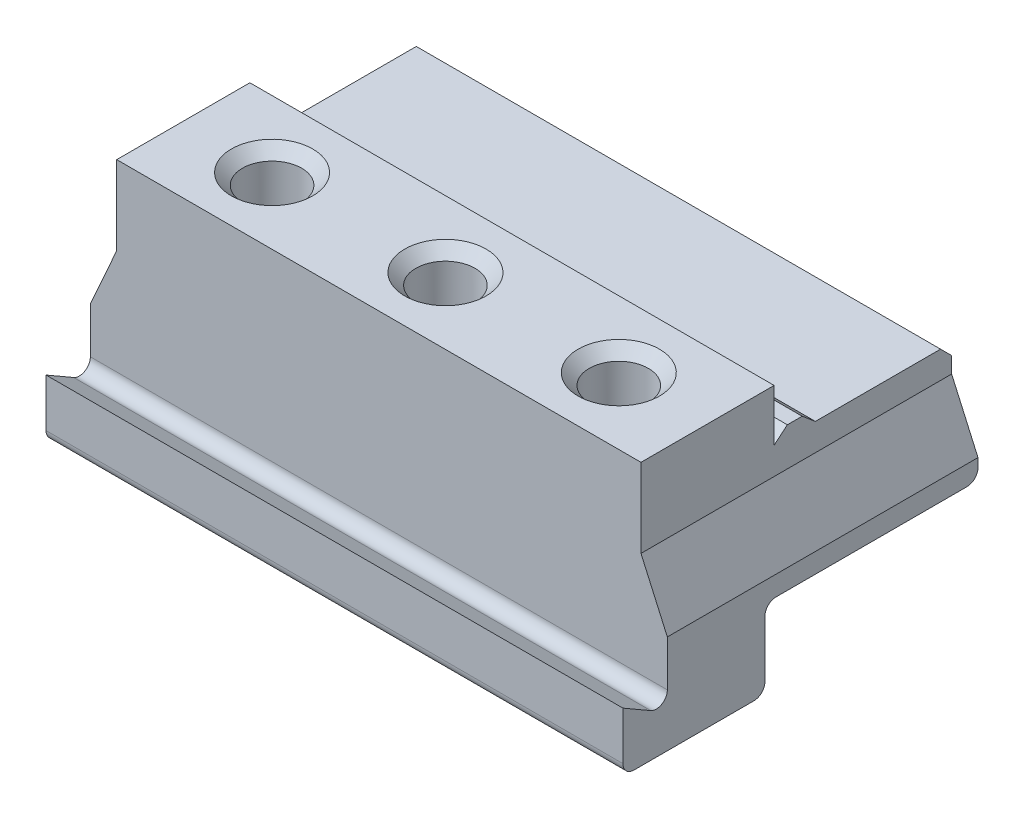
ISO-10303-21;
HEADER;
FILE_DESCRIPTION(('STEP AP214'),'2;1');
FILE_NAME('part.step','',(''),(''),'','','');
FILE_SCHEMA(('AUTOMOTIVE_DESIGN { 1 0 10303 214 1 1 1 1 }'));
ENDSEC;
DATA;
#1=APPLICATION_CONTEXT('core data for automotive mechanical design processes');
#2=APPLICATION_PROTOCOL_DEFINITION('international standard','automotive_design',2000,#1);
#3=PRODUCT_CONTEXT('',#1,'mechanical');
#4=PRODUCT('Part','Part','',(#3));
#5=PRODUCT_RELATED_PRODUCT_CATEGORY('part','',(#4));
#6=PRODUCT_DEFINITION_FORMATION('','',#4);
#7=PRODUCT_DEFINITION_CONTEXT('part definition',#1,'design');
#8=PRODUCT_DEFINITION('design','',#6,#7);
#9=PRODUCT_DEFINITION_SHAPE('','',#8);
#10=(LENGTH_UNIT() NAMED_UNIT(*) SI_UNIT(.MILLI.,.METRE.));
#11=(NAMED_UNIT(*) PLANE_ANGLE_UNIT() SI_UNIT($,.RADIAN.));
#12=(NAMED_UNIT(*) SI_UNIT($,.STERADIAN.) SOLID_ANGLE_UNIT());
#13=UNCERTAINTY_MEASURE_WITH_UNIT(LENGTH_MEASURE(1.E-05),#10,'distance_accuracy_value','');
#14=(GEOMETRIC_REPRESENTATION_CONTEXT(3) GLOBAL_UNCERTAINTY_ASSIGNED_CONTEXT((#13)) GLOBAL_UNIT_ASSIGNED_CONTEXT((#10,
#11,#12)) REPRESENTATION_CONTEXT('',''));
#15=CARTESIAN_POINT('',(0.,0.,0.));
#16=DIRECTION('',(0.,0.,1.));
#17=DIRECTION('',(1.,0.,0.));
#18=AXIS2_PLACEMENT_3D('',#15,#16,#17);
#19=CARTESIAN_POINT('',(78.,1.5,0.));
#20=DIRECTION('',(0.,0.,-1.));
#21=DIRECTION('',(0.,1.,0.));
#22=AXIS2_PLACEMENT_3D('',#19,#20,#21);
#23=PLANE('',#22);
#24=DIRECTION('',(0.,-1.,0.));
#25=VECTOR('',#24,1.);
#26=CARTESIAN_POINT('',(0.,1.5,0.));
#27=LINE('',#26,#25);
#28=CARTESIAN_POINT('',(0.,8.,0.));
#29=VERTEX_POINT('',#28);
#30=CARTESIAN_POINT('',(0.,1.5,0.));
#31=VERTEX_POINT('',#30);
#32=EDGE_CURVE('E279',#29,#31,#27,.T.);
#33=ORIENTED_EDGE('',*,*,#32,.T.);
#34=DIRECTION('',(-1.,0.,0.));
#35=VECTOR('',#34,1.);
#36=CARTESIAN_POINT('',(78.,1.5,0.));
#37=LINE('',#36,#35);
#38=CARTESIAN_POINT('',(78.,1.5,0.));
#39=VERTEX_POINT('',#38);
#40=EDGE_CURVE('E381',#39,#31,#37,.T.);
#41=ORIENTED_EDGE('',*,*,#40,.F.);
#42=DIRECTION('',(0.,-1.,0.));
#43=VECTOR('',#42,1.);
#44=CARTESIAN_POINT('',(78.,1.5,0.));
#45=LINE('',#44,#43);
#46=CARTESIAN_POINT('',(78.,8.,0.));
#47=VERTEX_POINT('',#46);
#48=EDGE_CURVE('E280',#47,#39,#45,.T.);
#49=ORIENTED_EDGE('',*,*,#48,.F.);
#50=DIRECTION('',(-1.,0.,0.));
#51=VECTOR('',#50,1.);
#52=CARTESIAN_POINT('',(78.,8.,0.));
#53=LINE('',#52,#51);
#54=EDGE_CURVE('E307',#47,#29,#53,.T.);
#55=ORIENTED_EDGE('',*,*,#54,.T.);
#56=EDGE_LOOP('',(#33,#41,#49,#55));
#57=FACE_BOUND('',#56,.T.);
#58=ADVANCED_FACE('F36',(#57),#23,.F.);
#59=CARTESIAN_POINT('',(78.,1.5,-1.5));
#60=DIRECTION('',(-1.,0.,0.));
#61=DIRECTION('',(0.,0.,1.));
#62=AXIS2_PLACEMENT_3D('',#59,#60,#61);
#63=CYLINDRICAL_SURFACE('',#62,1.5);
#64=CARTESIAN_POINT('',(0.,1.5,-1.5));
#65=DIRECTION('',(1.,0.,0.));
#66=DIRECTION('',(0.,0.,1.));
#67=AXIS2_PLACEMENT_3D('',#64,#65,#66);
#68=CIRCLE('',#67,1.5);
#69=CARTESIAN_POINT('',(0.,0.,-1.5));
#70=VERTEX_POINT('',#69);
#71=EDGE_CURVE('E310',#31,#70,#68,.T.);
#72=ORIENTED_EDGE('',*,*,#71,.T.);
#73=DIRECTION('',(-1.,0.,0.));
#74=VECTOR('',#73,1.);
#75=CARTESIAN_POINT('',(78.,0.,-1.5));
#76=LINE('',#75,#74);
#77=CARTESIAN_POINT('',(78.,0.,-1.5));
#78=VERTEX_POINT('',#77);
#79=EDGE_CURVE('E378',#78,#70,#76,.T.);
#80=ORIENTED_EDGE('',*,*,#79,.F.);
#81=CARTESIAN_POINT('',(78.,1.5,-1.5));
#82=DIRECTION('',(1.,0.,0.));
#83=DIRECTION('',(0.,0.,1.));
#84=AXIS2_PLACEMENT_3D('',#81,#82,#83);
#85=CIRCLE('',#84,1.5);
#86=EDGE_CURVE('E283',#39,#78,#85,.T.);
#87=ORIENTED_EDGE('',*,*,#86,.F.);
#88=ORIENTED_EDGE('',*,*,#40,.T.);
#89=EDGE_LOOP('',(#72,#80,#87,#88));
#90=FACE_BOUND('',#89,.T.);
#91=ADVANCED_FACE('F466',(#90),#63,.T.);
#92=CARTESIAN_POINT('',(78.,0.,-17.7));
#93=DIRECTION('',(0.,1.,0.));
#94=DIRECTION('',(0.,0.,1.));
#95=AXIS2_PLACEMENT_3D('',#92,#93,#94);
#96=PLANE('',#95);
#97=DIRECTION('',(0.,0.,-1.));
#98=VECTOR('',#97,1.);
#99=CARTESIAN_POINT('',(0.,0.,-17.7));
#100=LINE('',#99,#98);
#101=CARTESIAN_POINT('',(0.,0.,-17.7));
#102=VERTEX_POINT('',#101);
#103=EDGE_CURVE('E312',#70,#102,#100,.T.);
#104=ORIENTED_EDGE('',*,*,#103,.T.);
#105=DIRECTION('',(-1.,0.,0.));
#106=VECTOR('',#105,1.);
#107=CARTESIAN_POINT('',(78.,0.,-17.7));
#108=LINE('',#107,#106);
#109=CARTESIAN_POINT('',(78.,0.,-17.7));
#110=VERTEX_POINT('',#109);
#111=EDGE_CURVE('E375',#110,#102,#108,.T.);
#112=ORIENTED_EDGE('',*,*,#111,.F.);
#113=DIRECTION('',(0.,0.,-1.));
#114=VECTOR('',#113,1.);
#115=CARTESIAN_POINT('',(78.,0.,-17.7));
#116=LINE('',#115,#114);
#117=EDGE_CURVE('E286',#78,#110,#116,.T.);
#118=ORIENTED_EDGE('',*,*,#117,.F.);
#119=ORIENTED_EDGE('',*,*,#79,.T.);
#120=EDGE_LOOP('',(#104,#112,#118,#119));
#121=FACE_BOUND('',#120,.T.);
#122=ADVANCED_FACE('F473',(#121),#96,.F.);
#123=CARTESIAN_POINT('',(78.,1.5,-17.7));
#124=DIRECTION('',(-1.,0.,0.));
#125=DIRECTION('',(0.,0.,1.));
#126=AXIS2_PLACEMENT_3D('',#123,#124,#125);
#127=CYLINDRICAL_SURFACE('',#126,1.5);
#128=CARTESIAN_POINT('',(0.,1.5,-17.7));
#129=DIRECTION('',(1.,0.,0.));
#130=DIRECTION('',(0.,0.,1.));
#131=AXIS2_PLACEMENT_3D('',#128,#129,#130);
#132=CIRCLE('',#131,1.5);
#133=CARTESIAN_POINT('',(0.,1.5,-19.2));
#134=VERTEX_POINT('',#133);
#135=EDGE_CURVE('E314',#102,#134,#132,.T.);
#136=ORIENTED_EDGE('',*,*,#135,.T.);
#137=DIRECTION('',(-1.,0.,0.));
#138=VECTOR('',#137,1.);
#139=CARTESIAN_POINT('',(78.,1.5,-19.2));
#140=LINE('',#139,#138);
#141=CARTESIAN_POINT('',(78.,1.5,-19.2));
#142=VERTEX_POINT('',#141);
#143=EDGE_CURVE('E372',#142,#134,#140,.T.);
#144=ORIENTED_EDGE('',*,*,#143,.F.);
#145=CARTESIAN_POINT('',(78.,1.5,-17.7));
#146=DIRECTION('',(1.,0.,0.));
#147=DIRECTION('',(0.,0.,1.));
#148=AXIS2_PLACEMENT_3D('',#145,#146,#147);
#149=CIRCLE('',#148,1.5);
#150=EDGE_CURVE('E288',#110,#142,#149,.T.);
#151=ORIENTED_EDGE('',*,*,#150,.F.);
#152=ORIENTED_EDGE('',*,*,#111,.T.);
#153=EDGE_LOOP('',(#136,#144,#151,#152));
#154=FACE_BOUND('',#153,.T.);
#155=ADVANCED_FACE('F477',(#154),#127,.T.);
#156=CARTESIAN_POINT('',(78.,9.16666666666666,-19.2));
#157=DIRECTION('',(0.,0.,1.));
#158=DIRECTION('',(0.,-1.,0.));
#159=AXIS2_PLACEMENT_3D('',#156,#157,#158);
#160=PLANE('',#159);
#161=DIRECTION('',(0.,1.,0.));
#162=VECTOR('',#161,1.);
#163=CARTESIAN_POINT('',(0.,9.16666666666666,-19.2));
#164=LINE('',#163,#162);
#165=CARTESIAN_POINT('',(0.,9.16666666666666,-19.2));
#166=VERTEX_POINT('',#165);
#167=EDGE_CURVE('E316',#134,#166,#164,.T.);
#168=ORIENTED_EDGE('',*,*,#167,.T.);
#169=DIRECTION('',(-1.,0.,0.));
#170=VECTOR('',#169,1.);
#171=CARTESIAN_POINT('',(78.,9.16666666666666,-19.2));
#172=LINE('',#171,#170);
#173=CARTESIAN_POINT('',(78.,9.16666666666666,-19.2));
#174=VERTEX_POINT('',#173);
#175=EDGE_CURVE('E369',#174,#166,#172,.T.);
#176=ORIENTED_EDGE('',*,*,#175,.F.);
#177=DIRECTION('',(0.,1.,0.));
#178=VECTOR('',#177,1.);
#179=CARTESIAN_POINT('',(78.,9.16666666666666,-19.2));
#180=LINE('',#179,#178);
#181=EDGE_CURVE('E290',#142,#174,#180,.T.);
#182=ORIENTED_EDGE('',*,*,#181,.F.);
#183=ORIENTED_EDGE('',*,*,#143,.T.);
#184=EDGE_LOOP('',(#168,#176,#182,#183));
#185=FACE_BOUND('',#184,.T.);
#186=ADVANCED_FACE('F482',(#185),#160,.F.);
#187=CARTESIAN_POINT('',(78.,9.16666666666666,-20.7));
#188=DIRECTION('',(-1.,0.,0.));
#189=DIRECTION('',(0.,0.,1.));
#190=AXIS2_PLACEMENT_3D('',#187,#188,#189);
#191=CYLINDRICAL_SURFACE('',#190,1.5);
#192=CARTESIAN_POINT('',(0.,9.16666666666666,-20.7));
#193=DIRECTION('',(-1.,0.,0.));
#194=DIRECTION('',(0.,0.,-1.));
#195=AXIS2_PLACEMENT_3D('',#192,#193,#194);
#196=CIRCLE('',#195,1.5);
#197=CARTESIAN_POINT('',(0.,10.6666666666667,-20.7));
#198=VERTEX_POINT('',#197);
#199=EDGE_CURVE('E318',#166,#198,#196,.T.);
#200=ORIENTED_EDGE('',*,*,#199,.T.);
#201=DIRECTION('',(-1.,0.,0.));
#202=VECTOR('',#201,1.);
#203=CARTESIAN_POINT('',(78.,10.6666666666667,-20.7));
#204=LINE('',#203,#202);
#205=CARTESIAN_POINT('',(78.,10.6666666666667,-20.7));
#206=VERTEX_POINT('',#205);
#207=EDGE_CURVE('E366',#206,#198,#204,.T.);
#208=ORIENTED_EDGE('',*,*,#207,.F.);
#209=CARTESIAN_POINT('',(78.,9.16666666666666,-20.7));
#210=DIRECTION('',(-1.,0.,0.));
#211=DIRECTION('',(0.,0.,-1.));
#212=AXIS2_PLACEMENT_3D('',#209,#210,#211);
#213=CIRCLE('',#212,1.5);
#214=EDGE_CURVE('E292',#174,#206,#213,.T.);
#215=ORIENTED_EDGE('',*,*,#214,.F.);
#216=ORIENTED_EDGE('',*,*,#175,.T.);
#217=EDGE_LOOP('',(#200,#208,#215,#216));
#218=FACE_BOUND('',#217,.T.);
#219=ADVANCED_FACE('F488',(#218),#191,.F.);
#220=CARTESIAN_POINT('',(78.,10.6666666666667,-46.5));
#221=DIRECTION('',(0.,1.,0.));
#222=DIRECTION('',(0.,0.,1.));
#223=AXIS2_PLACEMENT_3D('',#220,#221,#222);
#224=PLANE('',#223);
#225=DIRECTION('',(0.,0.,-1.));
#226=VECTOR('',#225,1.);
#227=CARTESIAN_POINT('',(0.,10.6666666666667,-46.5));
#228=LINE('',#227,#226);
#229=CARTESIAN_POINT('',(0.,10.6666666666667,-46.5));
#230=VERTEX_POINT('',#229);
#231=EDGE_CURVE('E320',#198,#230,#228,.T.);
#232=ORIENTED_EDGE('',*,*,#231,.T.);
#233=DIRECTION('',(-1.,0.,0.));
#234=VECTOR('',#233,1.);
#235=CARTESIAN_POINT('',(78.,10.6666666666667,-46.5));
#236=LINE('',#235,#234);
#237=CARTESIAN_POINT('',(78.,10.6666666666667,-46.5));
#238=VERTEX_POINT('',#237);
#239=EDGE_CURVE('E363',#238,#230,#236,.T.);
#240=ORIENTED_EDGE('',*,*,#239,.F.);
#241=DIRECTION('',(0.,0.,-1.));
#242=VECTOR('',#241,1.);
#243=CARTESIAN_POINT('',(78.,10.6666666666667,-46.5));
#244=LINE('',#243,#242);
#245=EDGE_CURVE('E294',#206,#238,#244,.T.);
#246=ORIENTED_EDGE('',*,*,#245,.F.);
#247=ORIENTED_EDGE('',*,*,#207,.T.);
#248=EDGE_LOOP('',(#232,#240,#246,#247));
#249=FACE_BOUND('',#248,.T.);
#250=ADVANCED_FACE('F492',(#249),#224,.F.);
#251=CARTESIAN_POINT('',(78.,12.1666666666667,-46.5));
#252=DIRECTION('',(-1.,0.,0.));
#253=DIRECTION('',(0.,0.,1.));
#254=AXIS2_PLACEMENT_3D('',#251,#252,#253);
#255=CYLINDRICAL_SURFACE('',#254,1.5);
#256=CARTESIAN_POINT('',(0.,12.1666666666667,-46.5));
#257=DIRECTION('',(1.,0.,0.));
#258=DIRECTION('',(0.,0.,1.));
#259=AXIS2_PLACEMENT_3D('',#256,#257,#258);
#260=CIRCLE('',#259,1.5);
#261=CARTESIAN_POINT('',(0.,12.1666666666667,-48.));
#262=VERTEX_POINT('',#261);
#263=EDGE_CURVE('E322',#230,#262,#260,.T.);
#264=ORIENTED_EDGE('',*,*,#263,.T.);
#265=DIRECTION('',(-1.,0.,0.));
#266=VECTOR('',#265,1.);
#267=CARTESIAN_POINT('',(78.,12.1666666666667,-48.));
#268=LINE('',#267,#266);
#269=CARTESIAN_POINT('',(78.,12.1666666666667,-48.));
#270=VERTEX_POINT('',#269);
#271=EDGE_CURVE('E361',#270,#262,#268,.T.);
#272=ORIENTED_EDGE('',*,*,#271,.F.);
#273=CARTESIAN_POINT('',(78.,12.1666666666667,-46.5));
#274=DIRECTION('',(1.,0.,0.));
#275=DIRECTION('',(0.,0.,1.));
#276=AXIS2_PLACEMENT_3D('',#273,#274,#275);
#277=CIRCLE('',#276,1.5);
#278=EDGE_CURVE('E296',#238,#270,#277,.T.);
#279=ORIENTED_EDGE('',*,*,#278,.F.);
#280=ORIENTED_EDGE('',*,*,#239,.T.);
#281=EDGE_LOOP('',(#264,#272,#279,#280));
#282=FACE_BOUND('',#281,.T.);
#283=ADVANCED_FACE('F497',(#282),#255,.T.);
#284=CARTESIAN_POINT('',(78.,23.5,-48.));
#285=DIRECTION('',(0.,0.,1.));
#286=DIRECTION('',(0.,-1.,0.));
#287=AXIS2_PLACEMENT_3D('',#284,#285,#286);
#288=PLANE('',#287);
#289=DIRECTION('',(0.406736643075801,0.913545457642601,0.));
#290=VECTOR('',#289,1.);
#291=CARTESIAN_POINT('',(0.,13.3333333333333,-48.));
#292=LINE('',#291,#290);
#293=CARTESIAN_POINT('',(0.,13.3333333333333,-48.));
#294=VERTEX_POINT('',#293);
#295=CARTESIAN_POINT('',(3.5618294824683,21.3333333333333,-48.));
#296=VERTEX_POINT('',#295);
#297=EDGE_CURVE('E59',#294,#296,#292,.T.);
#298=ORIENTED_EDGE('',*,*,#297,.T.);
#299=DIRECTION('',(0.,1.,0.));
#300=VECTOR('',#299,1.);
#301=CARTESIAN_POINT('',(3.5618294824683,32.,-48.));
#302=LINE('',#301,#300);
#303=CARTESIAN_POINT('',(3.5618294824683,23.5,-48.));
#304=VERTEX_POINT('',#303);
#305=EDGE_CURVE('E201',#296,#304,#302,.T.);
#306=ORIENTED_EDGE('',*,*,#305,.T.);
#307=DIRECTION('',(-1.,0.,0.));
#308=VECTOR('',#307,1.);
#309=CARTESIAN_POINT('',(78.,23.5,-48.));
#310=LINE('',#309,#308);
#311=CARTESIAN_POINT('',(74.4381705175317,23.5,-48.));
#312=VERTEX_POINT('',#311);
#313=EDGE_CURVE('E359',#312,#304,#310,.T.);
#314=ORIENTED_EDGE('',*,*,#313,.F.);
#315=DIRECTION('',(0.,-1.,0.));
#316=VECTOR('',#315,1.);
#317=CARTESIAN_POINT('',(74.4381705175317,32.,-48.));
#318=LINE('',#317,#316);
#319=CARTESIAN_POINT('',(74.4381705175317,21.3333333333333,-48.));
#320=VERTEX_POINT('',#319);
#321=EDGE_CURVE('E229',#312,#320,#318,.T.);
#322=ORIENTED_EDGE('',*,*,#321,.T.);
#323=DIRECTION('',(0.406736643075803,-0.9135454576426,0.));
#324=VECTOR('',#323,1.);
#325=CARTESIAN_POINT('',(78.,13.3333333333333,-48.));
#326=LINE('',#325,#324);
#327=CARTESIAN_POINT('',(78.,13.3333333333333,-48.));
#328=VERTEX_POINT('',#327);
#329=EDGE_CURVE('E232',#320,#328,#326,.T.);
#330=ORIENTED_EDGE('',*,*,#329,.T.);
#331=DIRECTION('',(0.,1.,0.));
#332=VECTOR('',#331,1.);
#333=CARTESIAN_POINT('',(78.,23.5,-48.));
#334=LINE('',#333,#332);
#335=EDGE_CURVE('E298',#270,#328,#334,.T.);
#336=ORIENTED_EDGE('',*,*,#335,.F.);
#337=ORIENTED_EDGE('',*,*,#271,.T.);
#338=DIRECTION('',(0.,1.,0.));
#339=VECTOR('',#338,1.);
#340=CARTESIAN_POINT('',(0.,23.5,-48.));
#341=LINE('',#340,#339);
#342=EDGE_CURVE('E213',#262,#294,#341,.T.);
#343=ORIENTED_EDGE('',*,*,#342,.T.);
#344=EDGE_LOOP('',(#298,#306,#314,#322,#330,#336,#337,#343));
#345=FACE_BOUND('',#344,.T.);
#346=ADVANCED_FACE('F210',(#345),#288,.F.);
#347=CARTESIAN_POINT('',(78.,25.,-46.5));
#348=DIRECTION('',(0.,-0.707106781186549,0.707106781186546));
#349=DIRECTION('',(0.,-0.707106781186546,-0.707106781186549));
#350=AXIS2_PLACEMENT_3D('',#347,#348,#349);
#351=PLANE('',#350);
#352=ORIENTED_EDGE('',*,*,#313,.T.);
#353=DIRECTION('',(0.,0.707106781186546,0.707106781186549));
#354=VECTOR('',#353,1.);
#355=CARTESIAN_POINT('',(3.56182948246829,25.,-46.5));
#356=LINE('',#355,#354);
#357=CARTESIAN_POINT('',(3.56182948246829,25.,-46.5));
#358=VERTEX_POINT('',#357);
#359=EDGE_CURVE('E204',#304,#358,#356,.T.);
#360=ORIENTED_EDGE('',*,*,#359,.T.);
#361=DIRECTION('',(-1.,0.,0.));
#362=VECTOR('',#361,1.);
#363=CARTESIAN_POINT('',(78.,25.,-46.5));
#364=LINE('',#363,#362);
#365=CARTESIAN_POINT('',(74.4381705175317,25.,-46.5));
#366=VERTEX_POINT('',#365);
#367=EDGE_CURVE('E356',#366,#358,#364,.T.);
#368=ORIENTED_EDGE('',*,*,#367,.F.);
#369=DIRECTION('',(0.,-0.707106781186546,-0.707106781186549));
#370=VECTOR('',#369,1.);
#371=CARTESIAN_POINT('',(74.4381705175317,25.,-46.5));
#372=LINE('',#371,#370);
#373=EDGE_CURVE('E260',#366,#312,#372,.T.);
#374=ORIENTED_EDGE('',*,*,#373,.T.);
#375=EDGE_LOOP('',(#352,#360,#368,#374));
#376=FACE_BOUND('',#375,.T.);
#377=ADVANCED_FACE('F439',(#376),#351,.F.);
#378=CARTESIAN_POINT('',(78.,25.,-29.5752607777826));
#379=DIRECTION('',(0.,-1.,0.));
#380=DIRECTION('',(0.,0.,-1.));
#381=AXIS2_PLACEMENT_3D('',#378,#379,#380);
#382=PLANE('',#381);
#383=ORIENTED_EDGE('',*,*,#367,.T.);
#384=DIRECTION('',(0.,0.,1.));
#385=VECTOR('',#384,1.);
#386=CARTESIAN_POINT('',(3.56182948246829,25.,-29.5752607777826));
#387=LINE('',#386,#385);
#388=CARTESIAN_POINT('',(3.56182948246829,25.,-29.5752607777826));
#389=VERTEX_POINT('',#388);
#390=EDGE_CURVE('E275',#358,#389,#387,.T.);
#391=ORIENTED_EDGE('',*,*,#390,.T.);
#392=DIRECTION('',(-1.,0.,0.));
#393=VECTOR('',#392,1.);
#394=CARTESIAN_POINT('',(78.,25.,-29.5752607777826));
#395=LINE('',#394,#393);
#396=CARTESIAN_POINT('',(74.4381705175317,25.,-29.5752607777826));
#397=VERTEX_POINT('',#396);
#398=EDGE_CURVE('E353',#397,#389,#395,.T.);
#399=ORIENTED_EDGE('',*,*,#398,.F.);
#400=DIRECTION('',(0.,0.,-1.));
#401=VECTOR('',#400,1.);
#402=CARTESIAN_POINT('',(74.4381705175317,25.,-29.5752607777826));
#403=LINE('',#402,#401);
#404=EDGE_CURVE('E257',#397,#366,#403,.T.);
#405=ORIENTED_EDGE('',*,*,#404,.T.);
#406=EDGE_LOOP('',(#383,#391,#399,#405));
#407=FACE_BOUND('',#406,.T.);
#408=ADVANCED_FACE('F436',(#407),#382,.F.);
#409=CARTESIAN_POINT('',(78.,26.5,-27.7876303888913));
#410=DIRECTION('',(0.,-0.766044443118974,0.642787609686544));
#411=DIRECTION('',(0.,-0.642787609686544,-0.766044443118974));
#412=AXIS2_PLACEMENT_3D('',#409,#410,#411);
#413=PLANE('',#412);
#414=ORIENTED_EDGE('',*,*,#398,.T.);
#415=DIRECTION('',(0.,0.642787609686544,0.766044443118975));
#416=VECTOR('',#415,1.);
#417=CARTESIAN_POINT('',(3.56182948246829,26.5,-27.7876303888913));
#418=LINE('',#417,#416);
#419=CARTESIAN_POINT('',(3.56182948246829,26.5,-27.7876303888913));
#420=VERTEX_POINT('',#419);
#421=EDGE_CURVE('E272',#389,#420,#418,.T.);
#422=ORIENTED_EDGE('',*,*,#421,.T.);
#423=DIRECTION('',(-1.,0.,0.));
#424=VECTOR('',#423,1.);
#425=CARTESIAN_POINT('',(78.,26.5,-27.7876303888913));
#426=LINE('',#425,#424);
#427=CARTESIAN_POINT('',(74.4381705175317,26.5,-27.7876303888913));
#428=VERTEX_POINT('',#427);
#429=EDGE_CURVE('E350',#428,#420,#426,.T.);
#430=ORIENTED_EDGE('',*,*,#429,.F.);
#431=DIRECTION('',(0.,-0.642787609686544,-0.766044443118975));
#432=VECTOR('',#431,1.);
#433=CARTESIAN_POINT('',(74.4381705175317,26.5,-27.7876303888913));
#434=LINE('',#433,#432);
#435=EDGE_CURVE('E254',#428,#397,#434,.T.);
#436=ORIENTED_EDGE('',*,*,#435,.T.);
#437=EDGE_LOOP('',(#414,#422,#430,#436));
#438=FACE_BOUND('',#437,.T.);
#439=ADVANCED_FACE('F433',(#438),#413,.F.);
#440=CARTESIAN_POINT('',(78.,26.5,-25.7876303888913));
#441=DIRECTION('',(0.,-1.,0.));
#442=DIRECTION('',(0.,0.,-1.));
#443=AXIS2_PLACEMENT_3D('',#440,#441,#442);
#444=PLANE('',#443);
#445=ORIENTED_EDGE('',*,*,#429,.T.);
#446=DIRECTION('',(0.,0.,1.));
#447=VECTOR('',#446,1.);
#448=CARTESIAN_POINT('',(3.56182948246829,26.5,-25.7876303888913));
#449=LINE('',#448,#447);
#450=CARTESIAN_POINT('',(3.56182948246829,26.5,-25.7876303888913));
#451=VERTEX_POINT('',#450);
#452=EDGE_CURVE('E269',#420,#451,#449,.T.);
#453=ORIENTED_EDGE('',*,*,#452,.T.);
#454=DIRECTION('',(-1.,0.,0.));
#455=VECTOR('',#454,1.);
#456=CARTESIAN_POINT('',(78.,26.5,-25.7876303888913));
#457=LINE('',#456,#455);
#458=CARTESIAN_POINT('',(74.4381705175317,26.5,-25.7876303888913));
#459=VERTEX_POINT('',#458);
#460=EDGE_CURVE('E347',#459,#451,#457,.T.);
#461=ORIENTED_EDGE('',*,*,#460,.F.);
#462=DIRECTION('',(0.,0.,-1.));
#463=VECTOR('',#462,1.);
#464=CARTESIAN_POINT('',(74.4381705175317,26.5,-25.7876303888913));
#465=LINE('',#464,#463);
#466=EDGE_CURVE('E251',#459,#428,#465,.T.);
#467=ORIENTED_EDGE('',*,*,#466,.T.);
#468=EDGE_LOOP('',(#445,#453,#461,#467));
#469=FACE_BOUND('',#468,.T.);
#470=ADVANCED_FACE('F430',(#469),#444,.F.);
#471=CARTESIAN_POINT('',(78.,25.,-24.));
#472=DIRECTION('',(0.,-0.766044443118974,-0.642787609686544));
#473=DIRECTION('',(0.,0.642787609686544,-0.766044443118974));
#474=AXIS2_PLACEMENT_3D('',#471,#472,#473);
#475=PLANE('',#474);
#476=ORIENTED_EDGE('',*,*,#460,.T.);
#477=DIRECTION('',(0.,-0.642787609686544,0.766044443118975));
#478=VECTOR('',#477,1.);
#479=CARTESIAN_POINT('',(3.56182948246829,25.,-24.));
#480=LINE('',#479,#478);
#481=CARTESIAN_POINT('',(3.56182948246829,25.,-24.));
#482=VERTEX_POINT('',#481);
#483=EDGE_CURVE('E266',#451,#482,#480,.T.);
#484=ORIENTED_EDGE('',*,*,#483,.T.);
#485=DIRECTION('',(-1.,0.,0.));
#486=VECTOR('',#485,1.);
#487=CARTESIAN_POINT('',(78.,25.,-24.));
#488=LINE('',#487,#486);
#489=CARTESIAN_POINT('',(74.4381705175317,25.,-24.));
#490=VERTEX_POINT('',#489);
#491=EDGE_CURVE('E344',#490,#482,#488,.T.);
#492=ORIENTED_EDGE('',*,*,#491,.F.);
#493=DIRECTION('',(0.,0.642787609686544,-0.766044443118975));
#494=VECTOR('',#493,1.);
#495=CARTESIAN_POINT('',(74.4381705175317,25.,-24.));
#496=LINE('',#495,#494);
#497=EDGE_CURVE('E248',#490,#459,#496,.T.);
#498=ORIENTED_EDGE('',*,*,#497,.T.);
#499=EDGE_LOOP('',(#476,#484,#492,#498));
#500=FACE_BOUND('',#499,.T.);
#501=ADVANCED_FACE('F427',(#500),#475,.F.);
#502=CARTESIAN_POINT('',(78.,32.,-24.));
#503=DIRECTION('',(0.,0.,1.));
#504=DIRECTION('',(1.,0.,0.));
#505=AXIS2_PLACEMENT_3D('',#502,#503,#504);
#506=PLANE('',#505);
#507=ORIENTED_EDGE('',*,*,#491,.T.);
#508=DIRECTION('',(0.,1.,0.));
#509=VECTOR('',#508,1.);
#510=CARTESIAN_POINT('',(3.56182948246829,32.,-24.));
#511=LINE('',#510,#509);
#512=CARTESIAN_POINT('',(3.5618294824683,32.,-24.));
#513=VERTEX_POINT('',#512);
#514=EDGE_CURVE('E263',#482,#513,#511,.T.);
#515=ORIENTED_EDGE('',*,*,#514,.T.);
#516=DIRECTION('',(-1.,0.,0.));
#517=VECTOR('',#516,1.);
#518=CARTESIAN_POINT('',(78.,32.,-24.));
#519=LINE('',#518,#517);
#520=CARTESIAN_POINT('',(74.4381705175317,32.,-24.));
#521=VERTEX_POINT('',#520);
#522=EDGE_CURVE('E341',#521,#513,#519,.T.);
#523=ORIENTED_EDGE('',*,*,#522,.F.);
#524=DIRECTION('',(0.,-1.,0.));
#525=VECTOR('',#524,1.);
#526=CARTESIAN_POINT('',(74.4381705175317,32.,-24.));
#527=LINE('',#526,#525);
#528=EDGE_CURVE('E245',#521,#490,#527,.T.);
#529=ORIENTED_EDGE('',*,*,#528,.T.);
#530=EDGE_LOOP('',(#507,#515,#523,#529));
#531=FACE_BOUND('',#530,.T.);
#532=ADVANCED_FACE('F416',(#531),#506,.F.);
#533=CARTESIAN_POINT('',(78.,32.,-6.));
#534=DIRECTION('',(0.,-1.,0.));
#535=DIRECTION('',(0.,0.,-1.));
#536=AXIS2_PLACEMENT_3D('',#533,#534,#535);
#537=PLANE('',#536);
#538=CARTESIAN_POINT('',(15.5618294824683,32.,-15.));
#539=DIRECTION('',(0.,-1.,0.));
#540=DIRECTION('',(0.,0.,-1.));
#541=AXIS2_PLACEMENT_3D('',#538,#539,#540);
#542=CIRCLE('',#541,5.50000000000002);
#543=CARTESIAN_POINT('',(15.5618294824683,32.,-20.5));
#544=VERTEX_POINT('',#543);
#545=EDGE_CURVE('E395',#544,#544,#542,.T.);
#546=ORIENTED_EDGE('',*,*,#545,.T.);
#547=EDGE_LOOP('',(#546));
#548=FACE_BOUND('',#547,.T.);
#549=CARTESIAN_POINT('',(39.,32.,-15.));
#550=DIRECTION('',(0.,-1.,0.));
#551=DIRECTION('',(0.,0.,-1.));
#552=AXIS2_PLACEMENT_3D('',#549,#550,#551);
#553=CIRCLE('',#552,5.50000000000002);
#554=CARTESIAN_POINT('',(39.,32.,-20.5));
#555=VERTEX_POINT('',#554);
#556=EDGE_CURVE('E392',#555,#555,#553,.T.);
#557=ORIENTED_EDGE('',*,*,#556,.T.);
#558=EDGE_LOOP('',(#557));
#559=FACE_BOUND('',#558,.T.);
#560=CARTESIAN_POINT('',(62.4381705175317,32.,-15.));
#561=DIRECTION('',(0.,-1.,0.));
#562=DIRECTION('',(0.,0.,-1.));
#563=AXIS2_PLACEMENT_3D('',#560,#561,#562);
#564=CIRCLE('',#563,5.50000000000003);
#565=CARTESIAN_POINT('',(62.4381705175317,32.,-20.5));
#566=VERTEX_POINT('',#565);
#567=EDGE_CURVE('E389',#566,#566,#564,.T.);
#568=ORIENTED_EDGE('',*,*,#567,.T.);
#569=EDGE_LOOP('',(#568));
#570=FACE_BOUND('',#569,.T.);
#571=ORIENTED_EDGE('',*,*,#522,.T.);
#572=DIRECTION('',(0.,0.,1.));
#573=VECTOR('',#572,1.);
#574=CARTESIAN_POINT('',(3.5618294824683,32.,-48.));
#575=LINE('',#574,#573);
#576=CARTESIAN_POINT('',(3.5618294824683,32.,-6.00000000000001));
#577=VERTEX_POINT('',#576);
#578=EDGE_CURVE('E197',#513,#577,#575,.T.);
#579=ORIENTED_EDGE('',*,*,#578,.T.);
#580=DIRECTION('',(-1.,0.,0.));
#581=VECTOR('',#580,1.);
#582=CARTESIAN_POINT('',(78.,32.,-6.));
#583=LINE('',#582,#581);
#584=CARTESIAN_POINT('',(74.4381705175317,32.,-6.00000000000001));
#585=VERTEX_POINT('',#584);
#586=EDGE_CURVE('E338',#585,#577,#583,.T.);
#587=ORIENTED_EDGE('',*,*,#586,.F.);
#588=DIRECTION('',(0.,0.,1.));
#589=VECTOR('',#588,1.);
#590=CARTESIAN_POINT('',(74.4381705175317,32.,-48.));
#591=LINE('',#590,#589);
#592=EDGE_CURVE('E236',#521,#585,#591,.T.);
#593=ORIENTED_EDGE('',*,*,#592,.F.);
#594=EDGE_LOOP('',(#571,#579,#587,#593));
#595=FACE_BOUND('',#594,.T.);
#596=ADVANCED_FACE('F412',(#548,#559,#570,#595),#537,.F.);
#597=CARTESIAN_POINT('',(78.,7.13397459621554,-6.));
#598=DIRECTION('',(0.,0.,-1.));
#599=DIRECTION('',(-1.,0.,0.));
#600=AXIS2_PLACEMENT_3D('',#597,#598,#599);
#601=PLANE('',#600);
#602=ORIENTED_EDGE('',*,*,#586,.T.);
#603=DIRECTION('',(0.,-1.,0.));
#604=VECTOR('',#603,1.);
#605=CARTESIAN_POINT('',(3.56182948246829,7.13397459621553,-6.));
#606=LINE('',#605,#604);
#607=CARTESIAN_POINT('',(3.56182948246829,21.3333333333333,-6.00000000000001));
#608=VERTEX_POINT('',#607);
#609=EDGE_CURVE('E387',#577,#608,#606,.T.);
#610=ORIENTED_EDGE('',*,*,#609,.T.);
#611=DIRECTION('',(-0.406736643075801,-0.913545457642601,0.));
#612=VECTOR('',#611,1.);
#613=CARTESIAN_POINT('',(10.600395668621,37.142211822991,-6.));
#614=LINE('',#613,#612);
#615=CARTESIAN_POINT('',(0.,13.3333333333333,-6.00000000000001));
#616=VERTEX_POINT('',#615);
#617=EDGE_CURVE('E194',#608,#616,#614,.T.);
#618=ORIENTED_EDGE('',*,*,#617,.T.);
#619=DIRECTION('',(0.,-1.,0.));
#620=VECTOR('',#619,1.);
#621=CARTESIAN_POINT('',(0.,7.13397459621554,-6.));
#622=LINE('',#621,#620);
#623=CARTESIAN_POINT('',(0.,7.13397459621554,-6.));
#624=VERTEX_POINT('',#623);
#625=EDGE_CURVE('E325',#616,#624,#622,.T.);
#626=ORIENTED_EDGE('',*,*,#625,.T.);
#627=DIRECTION('',(-1.,0.,0.));
#628=VECTOR('',#627,1.);
#629=CARTESIAN_POINT('',(78.,7.13397459621554,-6.));
#630=LINE('',#629,#628);
#631=CARTESIAN_POINT('',(78.,7.13397459621554,-6.));
#632=VERTEX_POINT('',#631);
#633=EDGE_CURVE('E335',#632,#624,#630,.T.);
#634=ORIENTED_EDGE('',*,*,#633,.F.);
#635=DIRECTION('',(0.,-1.,0.));
#636=VECTOR('',#635,1.);
#637=CARTESIAN_POINT('',(78.,7.13397459621554,-6.));
#638=LINE('',#637,#636);
#639=CARTESIAN_POINT('',(78.,13.3333333333334,-6.));
#640=VERTEX_POINT('',#639);
#641=EDGE_CURVE('E301',#640,#632,#638,.T.);
#642=ORIENTED_EDGE('',*,*,#641,.F.);
#643=DIRECTION('',(-0.406736643075803,0.9135454576426,0.));
#644=VECTOR('',#643,1.);
#645=CARTESIAN_POINT('',(80.3035106833836,8.1595636293726,-6.));
#646=LINE('',#645,#644);
#647=CARTESIAN_POINT('',(74.4381705175317,21.3333333333333,-6.));
#648=VERTEX_POINT('',#647);
#649=EDGE_CURVE('E51',#640,#648,#646,.T.);
#650=ORIENTED_EDGE('',*,*,#649,.T.);
#651=DIRECTION('',(0.,1.,0.));
#652=VECTOR('',#651,1.);
#653=CARTESIAN_POINT('',(74.4381705175317,7.13397459621554,-6.));
#654=LINE('',#653,#652);
#655=EDGE_CURVE('E384',#648,#585,#654,.T.);
#656=ORIENTED_EDGE('',*,*,#655,.T.);
#657=EDGE_LOOP('',(#602,#610,#618,#626,#634,#642,#650,#656));
#658=FACE_BOUND('',#657,.T.);
#659=ADVANCED_FACE('F415',(#658),#601,.F.);
#660=CARTESIAN_POINT('',(78.,7.13397459621554,-4.5));
#661=DIRECTION('',(-1.,0.,0.));
#662=DIRECTION('',(0.,0.,1.));
#663=AXIS2_PLACEMENT_3D('',#660,#661,#662);
#664=CYLINDRICAL_SURFACE('',#663,1.5);
#665=CARTESIAN_POINT('',(0.,7.13397459621554,-4.5));
#666=DIRECTION('',(-1.,0.,0.));
#667=DIRECTION('',(0.,0.,-1.));
#668=AXIS2_PLACEMENT_3D('',#665,#666,#667);
#669=CIRCLE('',#668,1.5);
#670=CARTESIAN_POINT('',(0.,5.83493649053888,-3.74999999999999));
#671=VERTEX_POINT('',#670);
#672=EDGE_CURVE('E327',#624,#671,#669,.T.);
#673=ORIENTED_EDGE('',*,*,#672,.T.);
#674=DIRECTION('',(-1.,0.,0.));
#675=VECTOR('',#674,1.);
#676=CARTESIAN_POINT('',(78.,5.83493649053888,-3.74999999999999));
#677=LINE('',#676,#675);
#678=CARTESIAN_POINT('',(78.,5.83493649053888,-3.74999999999999));
#679=VERTEX_POINT('',#678);
#680=EDGE_CURVE('E332',#679,#671,#677,.T.);
#681=ORIENTED_EDGE('',*,*,#680,.F.);
#682=CARTESIAN_POINT('',(78.,7.13397459621554,-4.5));
#683=DIRECTION('',(-1.,0.,0.));
#684=DIRECTION('',(0.,0.,-1.));
#685=AXIS2_PLACEMENT_3D('',#682,#683,#684);
#686=CIRCLE('',#685,1.5);
#687=EDGE_CURVE('E303',#632,#679,#686,.T.);
#688=ORIENTED_EDGE('',*,*,#687,.F.);
#689=ORIENTED_EDGE('',*,*,#633,.T.);
#690=EDGE_LOOP('',(#673,#681,#688,#689));
#691=FACE_BOUND('',#690,.T.);
#692=ADVANCED_FACE('F455',(#691),#664,.F.);
#693=CARTESIAN_POINT('',(78.,8.,0.));
#694=DIRECTION('',(0.,-0.866025403784436,0.500000000000005));
#695=DIRECTION('',(0.,-0.500000000000005,-0.866025403784436));
#696=AXIS2_PLACEMENT_3D('',#693,#694,#695);
#697=PLANE('',#696);
#698=DIRECTION('',(0.,0.500000000000005,0.866025403784436));
#699=VECTOR('',#698,1.);
#700=CARTESIAN_POINT('',(0.,8.,0.));
#701=LINE('',#700,#699);
#702=EDGE_CURVE('E284',#671,#29,#701,.T.);
#703=ORIENTED_EDGE('',*,*,#702,.T.);
#704=ORIENTED_EDGE('',*,*,#54,.F.);
#705=DIRECTION('',(0.,0.500000000000005,0.866025403784436));
#706=VECTOR('',#705,1.);
#707=CARTESIAN_POINT('',(78.,8.,0.));
#708=LINE('',#707,#706);
#709=EDGE_CURVE('E305',#679,#47,#708,.T.);
#710=ORIENTED_EDGE('',*,*,#709,.F.);
#711=ORIENTED_EDGE('',*,*,#680,.T.);
#712=EDGE_LOOP('',(#703,#704,#710,#711));
#713=FACE_BOUND('',#712,.T.);
#714=ADVANCED_FACE('F461',(#713),#697,.F.);
#715=CARTESIAN_POINT('',(78.,7.13397459621554,-4.5));
#716=DIRECTION('',(1.,0.,0.));
#717=DIRECTION('',(0.,0.,-1.));
#718=AXIS2_PLACEMENT_3D('',#715,#716,#717);
#719=PLANE('',#718);
#720=DIRECTION('',(0.,0.,1.));
#721=VECTOR('',#720,1.);
#722=CARTESIAN_POINT('',(78.,13.3333333333333,-48.));
#723=LINE('',#722,#721);
#724=EDGE_CURVE('E214',#328,#640,#723,.T.);
#725=ORIENTED_EDGE('',*,*,#724,.T.);
#726=ORIENTED_EDGE('',*,*,#641,.T.);
#727=ORIENTED_EDGE('',*,*,#687,.T.);
#728=ORIENTED_EDGE('',*,*,#709,.T.);
#729=ORIENTED_EDGE('',*,*,#48,.T.);
#730=ORIENTED_EDGE('',*,*,#86,.T.);
#731=ORIENTED_EDGE('',*,*,#117,.T.);
#732=ORIENTED_EDGE('',*,*,#150,.T.);
#733=ORIENTED_EDGE('',*,*,#181,.T.);
#734=ORIENTED_EDGE('',*,*,#214,.T.);
#735=ORIENTED_EDGE('',*,*,#245,.T.);
#736=ORIENTED_EDGE('',*,*,#278,.T.);
#737=ORIENTED_EDGE('',*,*,#335,.T.);
#738=EDGE_LOOP('',(#725,#726,#727,#728,#729,#730,#731,#732,#733,#734,#735,#736,#737));
#739=FACE_BOUND('',#738,.T.);
#740=ADVANCED_FACE('F447',(#739),#719,.T.);
#741=CARTESIAN_POINT('',(0.,7.13397459621554,-4.5));
#742=DIRECTION('',(1.,0.,0.));
#743=DIRECTION('',(0.,0.,-1.));
#744=AXIS2_PLACEMENT_3D('',#741,#742,#743);
#745=PLANE('',#744);
#746=ORIENTED_EDGE('',*,*,#625,.F.);
#747=DIRECTION('',(0.,0.,1.));
#748=VECTOR('',#747,1.);
#749=CARTESIAN_POINT('',(0.,13.3333333333333,-48.));
#750=LINE('',#749,#748);
#751=EDGE_CURVE('E198',#294,#616,#750,.T.);
#752=ORIENTED_EDGE('',*,*,#751,.F.);
#753=ORIENTED_EDGE('',*,*,#342,.F.);
#754=ORIENTED_EDGE('',*,*,#263,.F.);
#755=ORIENTED_EDGE('',*,*,#231,.F.);
#756=ORIENTED_EDGE('',*,*,#199,.F.);
#757=ORIENTED_EDGE('',*,*,#167,.F.);
#758=ORIENTED_EDGE('',*,*,#135,.F.);
#759=ORIENTED_EDGE('',*,*,#103,.F.);
#760=ORIENTED_EDGE('',*,*,#71,.F.);
#761=ORIENTED_EDGE('',*,*,#32,.F.);
#762=ORIENTED_EDGE('',*,*,#702,.F.);
#763=ORIENTED_EDGE('',*,*,#672,.F.);
#764=EDGE_LOOP('',(#746,#752,#753,#754,#755,#756,#757,#758,#759,#760,#761,#762,#763));
#765=FACE_BOUND('',#764,.T.);
#766=ADVANCED_FACE('F499',(#765),#745,.F.);
#767=CARTESIAN_POINT('',(3.5618294824683,32.,-48.));
#768=DIRECTION('',(1.,0.,0.));
#769=DIRECTION('',(0.,1.,0.));
#770=AXIS2_PLACEMENT_3D('',#767,#768,#769);
#771=PLANE('',#770);
#772=ORIENTED_EDGE('',*,*,#305,.F.);
#773=DIRECTION('',(0.,0.,1.));
#774=VECTOR('',#773,1.);
#775=CARTESIAN_POINT('',(3.5618294824683,21.3333333333333,-48.));
#776=LINE('',#775,#774);
#777=EDGE_CURVE('E190',#296,#608,#776,.T.);
#778=ORIENTED_EDGE('',*,*,#777,.T.);
#779=ORIENTED_EDGE('',*,*,#609,.F.);
#780=ORIENTED_EDGE('',*,*,#578,.F.);
#781=ORIENTED_EDGE('',*,*,#514,.F.);
#782=ORIENTED_EDGE('',*,*,#483,.F.);
#783=ORIENTED_EDGE('',*,*,#452,.F.);
#784=ORIENTED_EDGE('',*,*,#421,.F.);
#785=ORIENTED_EDGE('',*,*,#390,.F.);
#786=ORIENTED_EDGE('',*,*,#359,.F.);
#787=EDGE_LOOP('',(#772,#778,#779,#780,#781,#782,#783,#784,#785,#786));
#788=FACE_BOUND('',#787,.T.);
#789=ADVANCED_FACE('F202',(#788),#771,.F.);
#790=CARTESIAN_POINT('',(0.,13.3333333333333,-48.));
#791=DIRECTION('',(0.913545457642601,-0.406736643075801,0.));
#792=DIRECTION('',(0.406736643075801,0.913545457642601,0.));
#793=AXIS2_PLACEMENT_3D('',#790,#791,#792);
#794=PLANE('',#793);
#795=ORIENTED_EDGE('',*,*,#777,.F.);
#796=ORIENTED_EDGE('',*,*,#297,.F.);
#797=ORIENTED_EDGE('',*,*,#751,.T.);
#798=ORIENTED_EDGE('',*,*,#617,.F.);
#799=EDGE_LOOP('',(#795,#796,#797,#798));
#800=FACE_BOUND('',#799,.T.);
#801=ADVANCED_FACE('F192',(#800),#794,.F.);
#802=CARTESIAN_POINT('',(74.4381705175317,32.,-48.));
#803=DIRECTION('',(-1.,0.,0.));
#804=DIRECTION('',(0.,0.,1.));
#805=AXIS2_PLACEMENT_3D('',#802,#803,#804);
#806=PLANE('',#805);
#807=ORIENTED_EDGE('',*,*,#404,.F.);
#808=ORIENTED_EDGE('',*,*,#435,.F.);
#809=ORIENTED_EDGE('',*,*,#466,.F.);
#810=ORIENTED_EDGE('',*,*,#497,.F.);
#811=ORIENTED_EDGE('',*,*,#528,.F.);
#812=ORIENTED_EDGE('',*,*,#592,.T.);
#813=ORIENTED_EDGE('',*,*,#655,.F.);
#814=DIRECTION('',(0.,0.,1.));
#815=VECTOR('',#814,1.);
#816=CARTESIAN_POINT('',(74.4381705175317,21.3333333333333,-48.));
#817=LINE('',#816,#815);
#818=EDGE_CURVE('E216',#320,#648,#817,.T.);
#819=ORIENTED_EDGE('',*,*,#818,.F.);
#820=ORIENTED_EDGE('',*,*,#321,.F.);
#821=ORIENTED_EDGE('',*,*,#373,.F.);
#822=EDGE_LOOP('',(#807,#808,#809,#810,#811,#812,#813,#819,#820,#821));
#823=FACE_BOUND('',#822,.T.);
#824=ADVANCED_FACE('F443',(#823),#806,.F.);
#825=CARTESIAN_POINT('',(78.,13.3333333333333,-48.));
#826=DIRECTION('',(-0.9135454576426,-0.406736643075803,0.));
#827=DIRECTION('',(0.406736643075803,-0.9135454576426,0.));
#828=AXIS2_PLACEMENT_3D('',#825,#826,#827);
#829=PLANE('',#828);
#830=ORIENTED_EDGE('',*,*,#724,.F.);
#831=ORIENTED_EDGE('',*,*,#329,.F.);
#832=ORIENTED_EDGE('',*,*,#818,.T.);
#833=ORIENTED_EDGE('',*,*,#649,.F.);
#834=EDGE_LOOP('',(#830,#831,#832,#833));
#835=FACE_BOUND('',#834,.T.);
#836=ADVANCED_FACE('F444',(#835),#829,.F.);
#837=CARTESIAN_POINT('',(39.,-11.3137084989848,-15.));
#838=DIRECTION('',(0.,1.,0.));
#839=DIRECTION('',(0.,0.,1.));
#840=AXIS2_PLACEMENT_3D('',#837,#838,#839);
#841=CYLINDRICAL_SURFACE('',#840,4.00000000000001);
#842=CARTESIAN_POINT('',(39.,30.5,-15.));
#843=DIRECTION('',(0.,-1.,0.));
#844=DIRECTION('',(0.,0.,-1.));
#845=AXIS2_PLACEMENT_3D('',#842,#843,#844);
#846=CIRCLE('',#845,4.00000000000001);
#847=CARTESIAN_POINT('',(39.,30.5,-19.));
#848=VERTEX_POINT('',#847);
#849=EDGE_CURVE('E44',#848,#848,#846,.F.);
#850=ORIENTED_EDGE('',*,*,#849,.T.);
#851=EDGE_LOOP('',(#850));
#852=FACE_BOUND('',#851,.T.);
#853=CARTESIAN_POINT('',(39.,22.,-15.));
#854=DIRECTION('',(0.,1.,0.));
#855=DIRECTION('',(0.,0.,1.));
#856=AXIS2_PLACEMENT_3D('',#853,#854,#855);
#857=CIRCLE('',#856,4.00000000000001);
#858=CARTESIAN_POINT('',(39.,22.,-11.));
#859=VERTEX_POINT('',#858);
#860=EDGE_CURVE('E219',#859,#859,#857,.F.);
#861=ORIENTED_EDGE('',*,*,#860,.T.);
#862=EDGE_LOOP('',(#861));
#863=FACE_BOUND('',#862,.T.);
#864=ADVANCED_FACE('F403',(#852,#863),#841,.F.);
#865=CARTESIAN_POINT('',(78.,22.,-17.7));
#866=DIRECTION('',(0.,1.,0.));
#867=DIRECTION('',(0.,0.,1.));
#868=AXIS2_PLACEMENT_3D('',#865,#866,#867);
#869=PLANE('',#868);
#870=ORIENTED_EDGE('',*,*,#860,.F.);
#871=EDGE_LOOP('',(#870));
#872=FACE_BOUND('',#871,.T.);
#873=ADVANCED_FACE('F544',(#872),#869,.T.);
#874=CARTESIAN_POINT('',(62.4381705175317,-11.3137084989848,-15.));
#875=DIRECTION('',(0.,1.,0.));
#876=DIRECTION('',(0.,0.,1.));
#877=AXIS2_PLACEMENT_3D('',#874,#875,#876);
#878=CYLINDRICAL_SURFACE('',#877,4.00000000000003);
#879=CARTESIAN_POINT('',(62.4381705175317,30.5,-15.));
#880=DIRECTION('',(0.,-1.,0.));
#881=DIRECTION('',(0.,0.,-1.));
#882=AXIS2_PLACEMENT_3D('',#879,#880,#881);
#883=CIRCLE('',#882,4.00000000000003);
#884=CARTESIAN_POINT('',(62.4381705175317,30.5,-19.));
#885=VERTEX_POINT('',#884);
#886=EDGE_CURVE('E12',#885,#885,#883,.F.);
#887=ORIENTED_EDGE('',*,*,#886,.T.);
#888=EDGE_LOOP('',(#887));
#889=FACE_BOUND('',#888,.T.);
#890=CARTESIAN_POINT('',(62.4381705175317,22.,-15.));
#891=DIRECTION('',(0.,1.,0.));
#892=DIRECTION('',(0.,0.,1.));
#893=AXIS2_PLACEMENT_3D('',#890,#891,#892);
#894=CIRCLE('',#893,4.00000000000003);
#895=CARTESIAN_POINT('',(62.4381705175317,22.,-11.));
#896=VERTEX_POINT('',#895);
#897=EDGE_CURVE('E536',#896,#896,#894,.F.);
#898=ORIENTED_EDGE('',*,*,#897,.T.);
#899=EDGE_LOOP('',(#898));
#900=FACE_BOUND('',#899,.T.);
#901=ADVANCED_FACE('F546',(#889,#900),#878,.F.);
#902=CARTESIAN_POINT('',(78.,22.,-17.7));
#903=DIRECTION('',(0.,1.,0.));
#904=DIRECTION('',(0.,0.,1.));
#905=AXIS2_PLACEMENT_3D('',#902,#903,#904);
#906=PLANE('',#905);
#907=ORIENTED_EDGE('',*,*,#897,.F.);
#908=EDGE_LOOP('',(#907));
#909=FACE_BOUND('',#908,.T.);
#910=ADVANCED_FACE('F532',(#909),#906,.T.);
#911=CARTESIAN_POINT('',(15.5618294824683,-11.3137084989848,-15.));
#912=DIRECTION('',(0.,1.,0.));
#913=DIRECTION('',(0.,0.,1.));
#914=AXIS2_PLACEMENT_3D('',#911,#912,#913);
#915=CYLINDRICAL_SURFACE('',#914,4.);
#916=CARTESIAN_POINT('',(15.5618294824683,30.5,-15.));
#917=DIRECTION('',(0.,-1.,0.));
#918=DIRECTION('',(0.,0.,-1.));
#919=AXIS2_PLACEMENT_3D('',#916,#917,#918);
#920=CIRCLE('',#919,4.);
#921=CARTESIAN_POINT('',(15.5618294824683,30.5,-19.));
#922=VERTEX_POINT('',#921);
#923=EDGE_CURVE('E398',#922,#922,#920,.F.);
#924=ORIENTED_EDGE('',*,*,#923,.T.);
#925=EDGE_LOOP('',(#924));
#926=FACE_BOUND('',#925,.T.);
#927=CARTESIAN_POINT('',(15.5618294824683,22.,-15.));
#928=DIRECTION('',(0.,1.,0.));
#929=DIRECTION('',(0.,0.,1.));
#930=AXIS2_PLACEMENT_3D('',#927,#928,#929);
#931=CIRCLE('',#930,4.);
#932=CARTESIAN_POINT('',(15.5618294824683,22.,-11.));
#933=VERTEX_POINT('',#932);
#934=EDGE_CURVE('E233',#933,#933,#931,.F.);
#935=ORIENTED_EDGE('',*,*,#934,.T.);
#936=EDGE_LOOP('',(#935));
#937=FACE_BOUND('',#936,.T.);
#938=ADVANCED_FACE('F523',(#926,#937),#915,.F.);
#939=CARTESIAN_POINT('',(78.,22.,-17.7));
#940=DIRECTION('',(0.,1.,0.));
#941=DIRECTION('',(0.,0.,1.));
#942=AXIS2_PLACEMENT_3D('',#939,#940,#941);
#943=PLANE('',#942);
#944=ORIENTED_EDGE('',*,*,#934,.F.);
#945=EDGE_LOOP('',(#944));
#946=FACE_BOUND('',#945,.T.);
#947=ADVANCED_FACE('F518',(#946),#943,.T.);
#948=CARTESIAN_POINT('',(15.5618294824683,32.,-15.));
#949=DIRECTION('',(0.,1.,0.));
#950=DIRECTION('',(0.,0.,1.));
#951=AXIS2_PLACEMENT_3D('',#948,#949,#950);
#952=CONICAL_SURFACE('',#951,5.50000000000002,0.785398163397448);
#953=ORIENTED_EDGE('',*,*,#923,.F.);
#954=EDGE_LOOP('',(#953));
#955=FACE_BOUND('',#954,.T.);
#956=ORIENTED_EDGE('',*,*,#545,.F.);
#957=EDGE_LOOP('',(#956));
#958=FACE_BOUND('',#957,.T.);
#959=ADVANCED_FACE('F409',(#955,#958),#952,.F.);
#960=CARTESIAN_POINT('',(39.,32.,-15.));
#961=DIRECTION('',(0.,1.,0.));
#962=DIRECTION('',(0.,0.,1.));
#963=AXIS2_PLACEMENT_3D('',#960,#961,#962);
#964=CONICAL_SURFACE('',#963,5.50000000000002,0.785398163397448);
#965=ORIENTED_EDGE('',*,*,#849,.F.);
#966=EDGE_LOOP('',(#965));
#967=FACE_BOUND('',#966,.T.);
#968=ORIENTED_EDGE('',*,*,#556,.F.);
#969=EDGE_LOOP('',(#968));
#970=FACE_BOUND('',#969,.T.);
#971=ADVANCED_FACE('F406',(#967,#970),#964,.F.);
#972=CARTESIAN_POINT('',(62.4381705175317,32.,-15.));
#973=DIRECTION('',(0.,1.,0.));
#974=DIRECTION('',(0.,0.,1.));
#975=AXIS2_PLACEMENT_3D('',#972,#973,#974);
#976=CONICAL_SURFACE('',#975,5.50000000000003,0.78539816339745);
#977=ORIENTED_EDGE('',*,*,#886,.F.);
#978=EDGE_LOOP('',(#977));
#979=FACE_BOUND('',#978,.T.);
#980=ORIENTED_EDGE('',*,*,#567,.F.);
#981=EDGE_LOOP('',(#980));
#982=FACE_BOUND('',#981,.T.);
#983=ADVANCED_FACE('F38',(#979,#982),#976,.F.);
#984=CLOSED_SHELL('',(#58,#91,#122,#155,#186,#219,#250,#283,#346,#377,#408,#439,#470,#501,#532,
#596,#659,#692,#714,#740,#766,#789,#801,#824,#836,#864,#873,#901,#910,#938,#947,#959,#971,#983));
#985=MANIFOLD_SOLID_BREP('B2',#984);
#986=ADVANCED_BREP_SHAPE_REPRESENTATION('',(#18,#985),#14);
#987=SHAPE_DEFINITION_REPRESENTATION(#9,#986);
ENDSEC;
END-ISO-10303-21;
